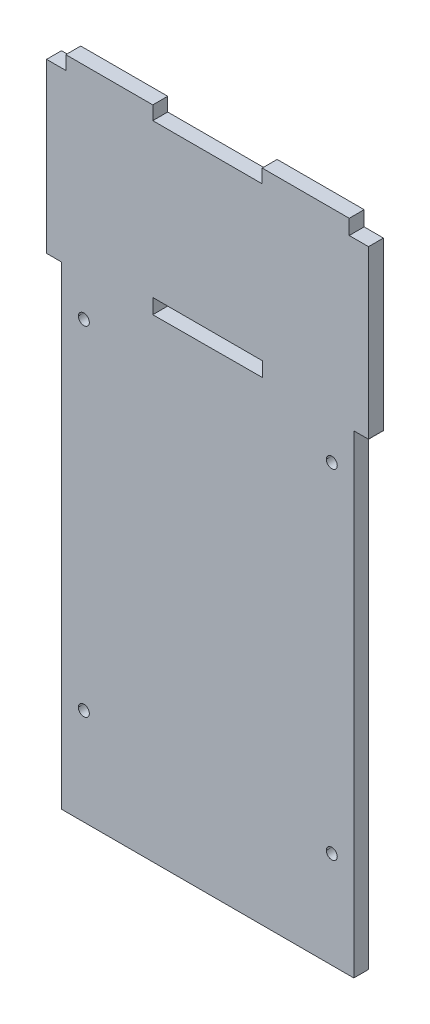
ISO-10303-21;
HEADER;
FILE_DESCRIPTION(('STEP AP214'),'2;1');
FILE_NAME('part.step','',(''),(''),'','','');
FILE_SCHEMA(('AUTOMOTIVE_DESIGN { 1 0 10303 214 1 1 1 1 }'));
ENDSEC;
DATA;
#1=APPLICATION_CONTEXT('core data for automotive mechanical design processes');
#2=APPLICATION_PROTOCOL_DEFINITION('international standard','automotive_design',2000,#1);
#3=PRODUCT_CONTEXT('',#1,'mechanical');
#4=PRODUCT('Part','Part','',(#3));
#5=PRODUCT_RELATED_PRODUCT_CATEGORY('part','',(#4));
#6=PRODUCT_DEFINITION_FORMATION('','',#4);
#7=PRODUCT_DEFINITION_CONTEXT('part definition',#1,'design');
#8=PRODUCT_DEFINITION('design','',#6,#7);
#9=PRODUCT_DEFINITION_SHAPE('','',#8);
#10=(LENGTH_UNIT() NAMED_UNIT(*) SI_UNIT(.MILLI.,.METRE.));
#11=(NAMED_UNIT(*) PLANE_ANGLE_UNIT() SI_UNIT($,.RADIAN.));
#12=(NAMED_UNIT(*) SI_UNIT($,.STERADIAN.) SOLID_ANGLE_UNIT());
#13=UNCERTAINTY_MEASURE_WITH_UNIT(LENGTH_MEASURE(1.E-05),#10,'distance_accuracy_value','');
#14=(GEOMETRIC_REPRESENTATION_CONTEXT(3) GLOBAL_UNCERTAINTY_ASSIGNED_CONTEXT((#13)) GLOBAL_UNIT_ASSIGNED_CONTEXT((#10,
#11,#12)) REPRESENTATION_CONTEXT('',''));
#15=CARTESIAN_POINT('',(0.,0.,0.));
#16=DIRECTION('',(0.,0.,1.));
#17=DIRECTION('',(1.,0.,0.));
#18=AXIS2_PLACEMENT_3D('',#15,#16,#17);
#19=CARTESIAN_POINT('',(0.,0.,4.5));
#20=DIRECTION('',(0.,0.,1.));
#21=DIRECTION('',(1.,0.,0.));
#22=AXIS2_PLACEMENT_3D('',#19,#20,#21);
#23=PLANE('',#22);
#24=DIRECTION('',(1.,0.,0.));
#25=VECTOR('',#24,1.);
#26=CARTESIAN_POINT('',(1244.85837413323,-975.629345589417,4.5));
#27=LINE('',#26,#25);
#28=CARTESIAN_POINT('',(1244.85837413323,-975.629345589417,4.5));
#29=VERTEX_POINT('',#28);
#30=CARTESIAN_POINT('',(1249.29085052101,-975.629345589417,4.5));
#31=VERTEX_POINT('',#30);
#32=EDGE_CURVE('E391',#29,#31,#27,.T.);
#33=ORIENTED_EDGE('',*,*,#32,.T.);
#34=DIRECTION('',(-0.00975087722679571,0.999952459066584,0.));
#35=VECTOR('',#34,1.);
#36=CARTESIAN_POINT('',(1249.29085052101,-975.629345589417,4.5));
#37=LINE('',#36,#35);
#38=CARTESIAN_POINT('',(1249.29014496546,-975.556990867213,4.5));
#39=VERTEX_POINT('',#38);
#40=EDGE_CURVE('E394',#31,#39,#37,.T.);
#41=ORIENTED_EDGE('',*,*,#40,.T.);
#42=DIRECTION('',(0.,1.,0.));
#43=VECTOR('',#42,1.);
#44=CARTESIAN_POINT('',(1249.29014496546,-975.556990867213,4.5));
#45=LINE('',#44,#43);
#46=CARTESIAN_POINT('',(1249.29014496546,-925.376433379758,4.5));
#47=VERTEX_POINT('',#46);
#48=EDGE_CURVE('E397',#39,#47,#45,.T.);
#49=ORIENTED_EDGE('',*,*,#48,.T.);
#50=DIRECTION('',(-1.,0.,0.));
#51=VECTOR('',#50,1.);
#52=CARTESIAN_POINT('',(1249.29014496546,-925.376433379758,4.5));
#53=LINE('',#52,#51);
#54=CARTESIAN_POINT('',(1243.4768963558,-925.376433379758,4.5));
#55=VERTEX_POINT('',#54);
#56=EDGE_CURVE('E399',#47,#55,#53,.T.);
#57=ORIENTED_EDGE('',*,*,#56,.T.);
#58=DIRECTION('',(0.,1.,0.));
#59=VECTOR('',#58,1.);
#60=CARTESIAN_POINT('',(1243.4768963558,-925.376433379758,4.5));
#61=LINE('',#60,#59);
#62=CARTESIAN_POINT('',(1243.4768963558,-920.879186991993,4.5));
#63=VERTEX_POINT('',#62);
#64=EDGE_CURVE('E401',#55,#63,#61,.T.);
#65=ORIENTED_EDGE('',*,*,#64,.T.);
#66=DIRECTION('',(-1.,0.,0.));
#67=VECTOR('',#66,1.);
#68=CARTESIAN_POINT('',(1243.4768963558,-920.879186991993,4.5));
#69=LINE('',#68,#67);
#70=CARTESIAN_POINT('',(1217.26487247346,-920.879186991996,4.5));
#71=VERTEX_POINT('',#70);
#72=EDGE_CURVE('E403',#63,#71,#69,.T.);
#73=ORIENTED_EDGE('',*,*,#72,.T.);
#74=DIRECTION('',(0.,-1.,0.));
#75=VECTOR('',#74,1.);
#76=CARTESIAN_POINT('',(1217.26487247346,-920.879186991996,4.5));
#77=LINE('',#76,#75);
#78=CARTESIAN_POINT('',(1217.26487247346,-924.998820046522,4.5));
#79=VERTEX_POINT('',#78);
#80=EDGE_CURVE('E405',#71,#79,#77,.T.);
#81=ORIENTED_EDGE('',*,*,#80,.T.);
#82=DIRECTION('',(-1.,0.,0.));
#83=VECTOR('',#82,1.);
#84=CARTESIAN_POINT('',(1217.26487247346,-924.998820046522,4.5));
#85=LINE('',#84,#83);
#86=CARTESIAN_POINT('',(1184.2956724817,-924.998820046522,4.5));
#87=VERTEX_POINT('',#86);
#88=EDGE_CURVE('E407',#79,#87,#85,.T.);
#89=ORIENTED_EDGE('',*,*,#88,.T.);
#90=DIRECTION('',(0.,1.,0.));
#91=VECTOR('',#90,1.);
#92=CARTESIAN_POINT('',(1184.2956724817,-924.998820046522,4.5));
#93=LINE('',#92,#91);
#94=CARTESIAN_POINT('',(1184.2956724817,-920.879186991996,4.5));
#95=VERTEX_POINT('',#94);
#96=EDGE_CURVE('E409',#87,#95,#93,.T.);
#97=ORIENTED_EDGE('',*,*,#96,.T.);
#98=DIRECTION('',(-1.,0.,0.));
#99=VECTOR('',#98,1.);
#100=CARTESIAN_POINT('',(1184.2956724817,-920.879186991996,4.5));
#101=LINE('',#100,#99);
#102=CARTESIAN_POINT('',(1158.08364859937,-920.879186991996,4.5));
#103=VERTEX_POINT('',#102);
#104=EDGE_CURVE('E411',#95,#103,#101,.T.);
#105=ORIENTED_EDGE('',*,*,#104,.T.);
#106=DIRECTION('',(0.,-1.,0.));
#107=VECTOR('',#106,1.);
#108=CARTESIAN_POINT('',(1158.08364859937,-920.879186991996,4.5));
#109=LINE('',#108,#107);
#110=CARTESIAN_POINT('',(1158.08364859937,-924.998820046522,4.5));
#111=VERTEX_POINT('',#110);
#112=EDGE_CURVE('E413',#103,#111,#109,.T.);
#113=ORIENTED_EDGE('',*,*,#112,.T.);
#114=DIRECTION('',(-1.,0.,0.));
#115=VECTOR('',#114,1.);
#116=CARTESIAN_POINT('',(1158.08364859937,-924.998820046522,4.5));
#117=LINE('',#116,#115);
#118=CARTESIAN_POINT('',(1152.29071998971,-924.998820046522,4.5));
#119=VERTEX_POINT('',#118);
#120=EDGE_CURVE('E415',#111,#119,#117,.T.);
#121=ORIENTED_EDGE('',*,*,#120,.T.);
#122=DIRECTION('',(0.,-1.,0.));
#123=VECTOR('',#122,1.);
#124=CARTESIAN_POINT('',(1152.29071998971,-924.998820046522,4.5));
#125=LINE('',#124,#123);
#126=CARTESIAN_POINT('',(1152.29071998971,-975.629345589419,4.5));
#127=VERTEX_POINT('',#126);
#128=EDGE_CURVE('E417',#119,#127,#125,.T.);
#129=ORIENTED_EDGE('',*,*,#128,.T.);
#130=DIRECTION('',(1.,0.,0.));
#131=VECTOR('',#130,1.);
#132=CARTESIAN_POINT('',(1152.29071998971,-975.629345589419,4.5));
#133=LINE('',#132,#131);
#134=CARTESIAN_POINT('',(1156.72319637749,-975.629345589419,4.5));
#135=VERTEX_POINT('',#134);
#136=EDGE_CURVE('E419',#127,#135,#133,.T.);
#137=ORIENTED_EDGE('',*,*,#136,.T.);
#138=DIRECTION('',(0.,-1.,0.));
#139=VECTOR('',#138,1.);
#140=CARTESIAN_POINT('',(1156.72319637749,-1118.4058147204,4.5));
#141=LINE('',#140,#139);
#142=CARTESIAN_POINT('',(1156.72319637749,-1118.4058147204,4.5));
#143=VERTEX_POINT('',#142);
#144=EDGE_CURVE('E421',#135,#143,#141,.T.);
#145=ORIENTED_EDGE('',*,*,#144,.T.);
#146=DIRECTION('',(1.,0.,0.));
#147=VECTOR('',#146,1.);
#148=CARTESIAN_POINT('',(1244.85837413323,-1118.4058147204,4.5));
#149=LINE('',#148,#147);
#150=CARTESIAN_POINT('',(1244.85837413323,-1118.4058147204,4.5));
#151=VERTEX_POINT('',#150);
#152=EDGE_CURVE('E423',#143,#151,#149,.T.);
#153=ORIENTED_EDGE('',*,*,#152,.T.);
#154=DIRECTION('',(0.,1.,0.));
#155=VECTOR('',#154,1.);
#156=CARTESIAN_POINT('',(1244.85837413323,-975.629345589417,4.5));
#157=LINE('',#156,#155);
#158=EDGE_CURVE('E425',#151,#29,#157,.T.);
#159=ORIENTED_EDGE('',*,*,#158,.T.);
#160=EDGE_LOOP('',(#33,#41,#49,#57,#65,#73,#81,#89,#97,#105,#113,#121,#129,#137,#145,#153,#159));
#161=FACE_BOUND('',#160,.T.);
#162=CARTESIAN_POINT('',(1236.57292941308,-1089.25582222769,4.5));
#163=CARTESIAN_POINT('',(1236.57292941308,-1090.16704722746,4.5));
#164=CARTESIAN_POINT('',(1237.31224580178,-1090.90569333838,4.5));
#165=CARTESIAN_POINT('',(1238.22311802378,-1090.90569333838,4.5));
#166=CARTESIAN_POINT('',(1239.13469580133,-1090.90569333838,4.5));
#167=CARTESIAN_POINT('',(1239.87334191225,-1090.16704722746,4.5));
#168=CARTESIAN_POINT('',(1239.87334191225,-1089.25582222769,4.5));
#169=B_SPLINE_CURVE_WITH_KNOTS('',3,(#162,#163,#164,#165,#166,#167,#168),.UNSPECIFIED.,.F.,.F.,
(4,3,4),(2.,3.,4.),.UNSPECIFIED.);
#170=CARTESIAN_POINT('',(1236.57292941308,-1089.25582222769,4.5));
#171=VERTEX_POINT('',#170);
#172=CARTESIAN_POINT('',(1239.87334191225,-1089.25582222769,4.5));
#173=VERTEX_POINT('',#172);
#174=EDGE_CURVE('E354',#171,#173,#169,.T.);
#175=ORIENTED_EDGE('',*,*,#174,.F.);
#176=CARTESIAN_POINT('',(1239.87334191225,-1089.25582222769,4.5));
#177=CARTESIAN_POINT('',(1239.87334191225,-1088.34459722791,4.5));
#178=CARTESIAN_POINT('',(1239.13469580133,-1087.60563361699,4.5));
#179=CARTESIAN_POINT('',(1238.22311802378,-1087.60563361699,4.5));
#180=CARTESIAN_POINT('',(1237.31224580178,-1087.60563361699,4.5));
#181=CARTESIAN_POINT('',(1236.57292941308,-1088.34459722791,4.5));
#182=CARTESIAN_POINT('',(1236.57292941308,-1089.25582222769,4.5));
#183=B_SPLINE_CURVE_WITH_KNOTS('',3,(#176,#177,#178,#179,#180,#181,#182),.UNSPECIFIED.,.F.,.F.,
(4,3,4),(0.,1.,2.),.UNSPECIFIED.);
#184=EDGE_CURVE('E360',#173,#171,#183,.T.);
#185=ORIENTED_EDGE('',*,*,#184,.F.);
#186=EDGE_LOOP('',(#175,#185));
#187=FACE_BOUND('',#186,.T.);
#188=CARTESIAN_POINT('',(1161.87290526509,-1089.25582222769,4.5));
#189=CARTESIAN_POINT('',(1161.87290526509,-1090.16704722746,4.5));
#190=CARTESIAN_POINT('',(1162.61225693157,-1090.90569333838,4.5));
#191=CARTESIAN_POINT('',(1163.52312915356,-1090.90569333838,4.5));
#192=CARTESIAN_POINT('',(1164.43470693111,-1090.90569333838,4.5));
#193=CARTESIAN_POINT('',(1165.17331776426,-1090.16704722746,4.5));
#194=CARTESIAN_POINT('',(1165.17331776426,-1089.25582222769,4.5));
#195=B_SPLINE_CURVE_WITH_KNOTS('',3,(#188,#189,#190,#191,#192,#193,#194),.UNSPECIFIED.,.F.,.F.,
(4,3,4),(2.,3.,4.),.UNSPECIFIED.);
#196=CARTESIAN_POINT('',(1161.87290526509,-1089.25582222769,4.5));
#197=VERTEX_POINT('',#196);
#198=CARTESIAN_POINT('',(1165.17331776426,-1089.25582222769,4.5));
#199=VERTEX_POINT('',#198);
#200=EDGE_CURVE('E331',#197,#199,#195,.T.);
#201=ORIENTED_EDGE('',*,*,#200,.F.);
#202=CARTESIAN_POINT('',(1165.17331776426,-1089.25582222769,4.5));
#203=CARTESIAN_POINT('',(1165.17331776426,-1088.34459722791,4.5));
#204=CARTESIAN_POINT('',(1164.43470693111,-1087.60563361699,4.5));
#205=CARTESIAN_POINT('',(1163.52312915356,-1087.60563361699,4.5));
#206=CARTESIAN_POINT('',(1162.61225693157,-1087.60563361699,4.5));
#207=CARTESIAN_POINT('',(1161.87290526509,-1088.34459722791,4.5));
#208=CARTESIAN_POINT('',(1161.87290526509,-1089.25582222769,4.5));
#209=B_SPLINE_CURVE_WITH_KNOTS('',3,(#202,#203,#204,#205,#206,#207,#208),.UNSPECIFIED.,.F.,.F.,
(4,3,4),(0.,1.,2.),.UNSPECIFIED.);
#210=EDGE_CURVE('E325',#199,#197,#209,.T.);
#211=ORIENTED_EDGE('',*,*,#210,.F.);
#212=EDGE_LOOP('',(#201,#211));
#213=FACE_BOUND('',#212,.T.);
#214=CARTESIAN_POINT('',(1236.57292941308,-987.207618086522,4.5));
#215=CARTESIAN_POINT('',(1236.57292941308,-988.119195864072,4.5));
#216=CARTESIAN_POINT('',(1237.31224580178,-988.857806697221,4.5));
#217=CARTESIAN_POINT('',(1238.22311802378,-988.857806697221,4.5));
#218=CARTESIAN_POINT('',(1239.13469580133,-988.857806697221,4.5));
#219=CARTESIAN_POINT('',(1239.87334191225,-988.119195864072,4.5));
#220=CARTESIAN_POINT('',(1239.87334191225,-987.207618086522,4.5));
#221=B_SPLINE_CURVE_WITH_KNOTS('',3,(#214,#215,#216,#217,#218,#219,#220),.UNSPECIFIED.,.F.,.F.,
(4,3,4),(2.,3.,4.),.UNSPECIFIED.);
#222=CARTESIAN_POINT('',(1236.57292941308,-987.207618086522,4.5));
#223=VERTEX_POINT('',#222);
#224=CARTESIAN_POINT('',(1239.87334191225,-987.207618086522,4.5));
#225=VERTEX_POINT('',#224);
#226=EDGE_CURVE('E288',#223,#225,#221,.T.);
#227=ORIENTED_EDGE('',*,*,#226,.F.);
#228=CARTESIAN_POINT('',(1239.87334191225,-987.207618086522,4.5));
#229=CARTESIAN_POINT('',(1239.87334191225,-986.296745864528,4.5));
#230=CARTESIAN_POINT('',(1239.13469580133,-985.557746975824,4.5));
#231=CARTESIAN_POINT('',(1238.22311802378,-985.557746975824,4.5));
#232=CARTESIAN_POINT('',(1237.31224580178,-985.557746975824,4.5));
#233=CARTESIAN_POINT('',(1236.57292941308,-986.296745864528,4.5));
#234=CARTESIAN_POINT('',(1236.57292941308,-987.207618086522,4.5));
#235=B_SPLINE_CURVE_WITH_KNOTS('',3,(#228,#229,#230,#231,#232,#233,#234),.UNSPECIFIED.,.F.,.F.,
(4,3,4),(0.,1.,2.),.UNSPECIFIED.);
#236=EDGE_CURVE('E294',#225,#223,#235,.T.);
#237=ORIENTED_EDGE('',*,*,#236,.F.);
#238=EDGE_LOOP('',(#227,#237));
#239=FACE_BOUND('',#238,.T.);
#240=CARTESIAN_POINT('',(1161.87258776509,-987.207618086525,4.5));
#241=CARTESIAN_POINT('',(1161.87258776509,-988.119195864075,4.5));
#242=CARTESIAN_POINT('',(1162.61190415379,-988.857806697223,4.5));
#243=CARTESIAN_POINT('',(1163.52277637579,-988.857806697223,4.5));
#244=CARTESIAN_POINT('',(1164.43435415334,-988.857806697223,4.5));
#245=CARTESIAN_POINT('',(1165.17296498648,-988.119195864075,4.5));
#246=CARTESIAN_POINT('',(1165.17296498648,-987.207618086525,4.5));
#247=B_SPLINE_CURVE_WITH_KNOTS('',3,(#240,#241,#242,#243,#244,#245,#246),.UNSPECIFIED.,.F.,.F.,
(4,3,4),(2.,3.,4.),.UNSPECIFIED.);
#248=CARTESIAN_POINT('',(1161.87258776509,-987.207618086525,4.5));
#249=VERTEX_POINT('',#248);
#250=CARTESIAN_POINT('',(1165.17296498648,-987.207618086525,4.5));
#251=VERTEX_POINT('',#250);
#252=EDGE_CURVE('E263',#249,#251,#247,.T.);
#253=ORIENTED_EDGE('',*,*,#252,.F.);
#254=CARTESIAN_POINT('',(1165.17296498648,-987.207618086525,4.5));
#255=CARTESIAN_POINT('',(1165.17296498648,-986.296745864531,4.5));
#256=CARTESIAN_POINT('',(1164.43435415334,-985.557746975826,4.5));
#257=CARTESIAN_POINT('',(1163.52277637579,-985.557746975826,4.5));
#258=CARTESIAN_POINT('',(1162.61190415379,-985.557746975826,4.5));
#259=CARTESIAN_POINT('',(1161.87258776509,-986.296745864531,4.5));
#260=CARTESIAN_POINT('',(1161.87258776509,-987.207618086525,4.5));
#261=B_SPLINE_CURVE_WITH_KNOTS('',3,(#254,#255,#256,#257,#258,#259,#260),.UNSPECIFIED.,.F.,.F.,
(4,3,4),(0.,1.,2.),.UNSPECIFIED.);
#262=EDGE_CURVE('E257',#251,#249,#261,.T.);
#263=ORIENTED_EDGE('',*,*,#262,.F.);
#264=EDGE_LOOP('',(#253,#263));
#265=FACE_BOUND('',#264,.T.);
#266=DIRECTION('',(-1.,0.,0.));
#267=VECTOR('',#266,1.);
#268=CARTESIAN_POINT('',(1184.29634275948,-971.129347534989,4.5));
#269=LINE('',#268,#267);
#270=CARTESIAN_POINT('',(1217.28522775123,-971.129347534989,4.5));
#271=VERTEX_POINT('',#270);
#272=CARTESIAN_POINT('',(1184.29634275948,-971.129347534989,4.5));
#273=VERTEX_POINT('',#272);
#274=EDGE_CURVE('E229',#271,#273,#269,.T.);
#275=ORIENTED_EDGE('',*,*,#274,.F.);
#276=DIRECTION('',(0.,1.,0.));
#277=VECTOR('',#276,1.);
#278=CARTESIAN_POINT('',(1217.28522775123,-971.129347534989,4.5));
#279=LINE('',#278,#277);
#280=CARTESIAN_POINT('',(1217.28522775123,-975.502557256117,4.5));
#281=VERTEX_POINT('',#280);
#282=EDGE_CURVE('E221',#281,#271,#279,.T.);
#283=ORIENTED_EDGE('',*,*,#282,.F.);
#284=DIRECTION('',(0.999992614353706,0.00384333683662977,0.));
#285=VECTOR('',#284,1.);
#286=CARTESIAN_POINT('',(1184.29634275948,-975.629345589419,4.5));
#287=LINE('',#286,#285);
#288=CARTESIAN_POINT('',(1184.29634275948,-975.629345589419,4.5));
#289=VERTEX_POINT('',#288);
#290=EDGE_CURVE('E243',#289,#281,#287,.T.);
#291=ORIENTED_EDGE('',*,*,#290,.F.);
#292=DIRECTION('',(0.,-1.,0.));
#293=VECTOR('',#292,1.);
#294=CARTESIAN_POINT('',(1184.29634275948,-971.129347534989,4.5));
#295=LINE('',#294,#293);
#296=EDGE_CURVE('E241',#273,#289,#295,.T.);
#297=ORIENTED_EDGE('',*,*,#296,.F.);
#298=EDGE_LOOP('',(#275,#283,#291,#297));
#299=FACE_BOUND('',#298,.T.);
#300=ADVANCED_FACE('F30',(#161,#187,#213,#239,#265,#299),#23,.T.);
#301=CARTESIAN_POINT('',(0.,0.,0.));
#302=DIRECTION('',(0.,0.,1.));
#303=DIRECTION('',(1.,0.,0.));
#304=AXIS2_PLACEMENT_3D('',#301,#302,#303);
#305=PLANE('',#304);
#306=CARTESIAN_POINT('',(1165.17296498648,-987.207618086525,0.));
#307=CARTESIAN_POINT('',(1165.17296498648,-986.296745864531,0.));
#308=CARTESIAN_POINT('',(1164.43435415334,-985.557746975826,0.));
#309=CARTESIAN_POINT('',(1163.52277637579,-985.557746975826,0.));
#310=CARTESIAN_POINT('',(1162.61190415379,-985.557746975826,0.));
#311=CARTESIAN_POINT('',(1161.87258776509,-986.296745864531,0.));
#312=CARTESIAN_POINT('',(1161.87258776509,-987.207618086525,0.));
#313=B_SPLINE_CURVE_WITH_KNOTS('',3,(#306,#307,#308,#309,#310,#311,#312),.UNSPECIFIED.,.F.,.F.,
(4,3,4),(0.,1.,2.),.UNSPECIFIED.);
#314=CARTESIAN_POINT('',(1165.17296498648,-987.207618086525,0.));
#315=VERTEX_POINT('',#314);
#316=CARTESIAN_POINT('',(1161.87258776509,-987.207618086525,0.));
#317=VERTEX_POINT('',#316);
#318=EDGE_CURVE('E237',#315,#317,#313,.T.);
#319=ORIENTED_EDGE('',*,*,#318,.T.);
#320=CARTESIAN_POINT('',(1161.87258776509,-987.207618086525,0.));
#321=CARTESIAN_POINT('',(1161.87258776509,-988.119195864075,0.));
#322=CARTESIAN_POINT('',(1162.61190415379,-988.857806697223,0.));
#323=CARTESIAN_POINT('',(1163.52277637579,-988.857806697223,0.));
#324=CARTESIAN_POINT('',(1164.43435415334,-988.857806697223,0.));
#325=CARTESIAN_POINT('',(1165.17296498648,-988.119195864075,0.));
#326=CARTESIAN_POINT('',(1165.17296498648,-987.207618086525,0.));
#327=B_SPLINE_CURVE_WITH_KNOTS('',3,(#320,#321,#322,#323,#324,#325,#326),.UNSPECIFIED.,.F.,.F.,
(4,3,4),(2.,3.,4.),.UNSPECIFIED.);
#328=EDGE_CURVE('E264',#317,#315,#327,.T.);
#329=ORIENTED_EDGE('',*,*,#328,.T.);
#330=EDGE_LOOP('',(#319,#329));
#331=FACE_BOUND('',#330,.T.);
#332=CARTESIAN_POINT('',(1165.17331776426,-1089.25582222769,0.));
#333=CARTESIAN_POINT('',(1165.17331776426,-1088.34459722791,0.));
#334=CARTESIAN_POINT('',(1164.43470693111,-1087.60563361699,0.));
#335=CARTESIAN_POINT('',(1163.52312915356,-1087.60563361699,0.));
#336=CARTESIAN_POINT('',(1162.61225693157,-1087.60563361699,0.));
#337=CARTESIAN_POINT('',(1161.87290526509,-1088.34459722791,0.));
#338=CARTESIAN_POINT('',(1161.87290526509,-1089.25582222769,0.));
#339=B_SPLINE_CURVE_WITH_KNOTS('',3,(#332,#333,#334,#335,#336,#337,#338),.UNSPECIFIED.,.F.,.F.,
(4,3,4),(0.,1.,2.),.UNSPECIFIED.);
#340=CARTESIAN_POINT('',(1165.17331776426,-1089.25582222769,0.));
#341=VERTEX_POINT('',#340);
#342=CARTESIAN_POINT('',(1161.87290526509,-1089.25582222769,0.));
#343=VERTEX_POINT('',#342);
#344=EDGE_CURVE('E324',#341,#343,#339,.T.);
#345=ORIENTED_EDGE('',*,*,#344,.T.);
#346=CARTESIAN_POINT('',(1161.87290526509,-1089.25582222769,0.));
#347=CARTESIAN_POINT('',(1161.87290526509,-1090.16704722746,0.));
#348=CARTESIAN_POINT('',(1162.61225693157,-1090.90569333838,0.));
#349=CARTESIAN_POINT('',(1163.52312915356,-1090.90569333838,0.));
#350=CARTESIAN_POINT('',(1164.43470693111,-1090.90569333838,0.));
#351=CARTESIAN_POINT('',(1165.17331776426,-1090.16704722746,0.));
#352=CARTESIAN_POINT('',(1165.17331776426,-1089.25582222769,0.));
#353=B_SPLINE_CURVE_WITH_KNOTS('',3,(#346,#347,#348,#349,#350,#351,#352),.UNSPECIFIED.,.F.,.F.,
(4,3,4),(2.,3.,4.),.UNSPECIFIED.);
#354=EDGE_CURVE('E332',#343,#341,#353,.T.);
#355=ORIENTED_EDGE('',*,*,#354,.T.);
#356=EDGE_LOOP('',(#345,#355));
#357=FACE_BOUND('',#356,.T.);
#358=DIRECTION('',(1.,0.,0.));
#359=VECTOR('',#358,1.);
#360=CARTESIAN_POINT('',(1244.85837413323,-975.629345589417,0.));
#361=LINE('',#360,#359);
#362=CARTESIAN_POINT('',(1244.85837413323,-975.629345589417,0.));
#363=VERTEX_POINT('',#362);
#364=CARTESIAN_POINT('',(1249.29085052101,-975.629345589417,0.));
#365=VERTEX_POINT('',#364);
#366=EDGE_CURVE('E390',#363,#365,#361,.T.);
#367=ORIENTED_EDGE('',*,*,#366,.F.);
#368=DIRECTION('',(0.,1.,0.));
#369=VECTOR('',#368,1.);
#370=CARTESIAN_POINT('',(1244.85837413323,-975.629345589417,0.));
#371=LINE('',#370,#369);
#372=CARTESIAN_POINT('',(1244.85837413323,-1118.4058147204,0.));
#373=VERTEX_POINT('',#372);
#374=EDGE_CURVE('E395',#373,#363,#371,.T.);
#375=ORIENTED_EDGE('',*,*,#374,.F.);
#376=DIRECTION('',(1.,0.,0.));
#377=VECTOR('',#376,1.);
#378=CARTESIAN_POINT('',(1244.85837413323,-1118.4058147204,0.));
#379=LINE('',#378,#377);
#380=CARTESIAN_POINT('',(1156.72319637749,-1118.4058147204,0.));
#381=VERTEX_POINT('',#380);
#382=EDGE_CURVE('E460',#381,#373,#379,.T.);
#383=ORIENTED_EDGE('',*,*,#382,.F.);
#384=DIRECTION('',(0.,-1.,0.));
#385=VECTOR('',#384,1.);
#386=CARTESIAN_POINT('',(1156.72319637749,-1118.4058147204,0.));
#387=LINE('',#386,#385);
#388=CARTESIAN_POINT('',(1156.72319637749,-975.629345589419,0.));
#389=VERTEX_POINT('',#388);
#390=EDGE_CURVE('E458',#389,#381,#387,.T.);
#391=ORIENTED_EDGE('',*,*,#390,.F.);
#392=DIRECTION('',(1.,0.,0.));
#393=VECTOR('',#392,1.);
#394=CARTESIAN_POINT('',(1152.29071998971,-975.629345589419,0.));
#395=LINE('',#394,#393);
#396=CARTESIAN_POINT('',(1152.29071998971,-975.629345589419,0.));
#397=VERTEX_POINT('',#396);
#398=EDGE_CURVE('E456',#397,#389,#395,.T.);
#399=ORIENTED_EDGE('',*,*,#398,.F.);
#400=DIRECTION('',(0.,-1.,0.));
#401=VECTOR('',#400,1.);
#402=CARTESIAN_POINT('',(1152.29071998971,-975.556990867216,0.));
#403=LINE('',#402,#401);
#404=CARTESIAN_POINT('',(1152.29071998971,-924.998820046522,0.));
#405=VERTEX_POINT('',#404);
#406=EDGE_CURVE('E454',#405,#397,#403,.T.);
#407=ORIENTED_EDGE('',*,*,#406,.F.);
#408=DIRECTION('',(-1.,0.,0.));
#409=VECTOR('',#408,1.);
#410=CARTESIAN_POINT('',(1158.08364859937,-924.998820046522,0.));
#411=LINE('',#410,#409);
#412=CARTESIAN_POINT('',(1158.08364859937,-924.998820046522,0.));
#413=VERTEX_POINT('',#412);
#414=EDGE_CURVE('E451',#413,#405,#411,.T.);
#415=ORIENTED_EDGE('',*,*,#414,.F.);
#416=DIRECTION('',(0.,-1.,0.));
#417=VECTOR('',#416,1.);
#418=CARTESIAN_POINT('',(1158.08364859937,-920.879186991996,0.));
#419=LINE('',#418,#417);
#420=CARTESIAN_POINT('',(1158.08364859937,-920.879186991996,0.));
#421=VERTEX_POINT('',#420);
#422=EDGE_CURVE('E449',#421,#413,#419,.T.);
#423=ORIENTED_EDGE('',*,*,#422,.F.);
#424=DIRECTION('',(-1.,0.,0.));
#425=VECTOR('',#424,1.);
#426=CARTESIAN_POINT('',(1184.2956724817,-920.879186991996,0.));
#427=LINE('',#426,#425);
#428=CARTESIAN_POINT('',(1184.2956724817,-920.879186991996,0.));
#429=VERTEX_POINT('',#428);
#430=EDGE_CURVE('E447',#429,#421,#427,.T.);
#431=ORIENTED_EDGE('',*,*,#430,.F.);
#432=DIRECTION('',(0.,1.,0.));
#433=VECTOR('',#432,1.);
#434=CARTESIAN_POINT('',(1184.2956724817,-924.998820046522,0.));
#435=LINE('',#434,#433);
#436=CARTESIAN_POINT('',(1184.2956724817,-924.998820046522,0.));
#437=VERTEX_POINT('',#436);
#438=EDGE_CURVE('E445',#437,#429,#435,.T.);
#439=ORIENTED_EDGE('',*,*,#438,.F.);
#440=DIRECTION('',(-1.,0.,0.));
#441=VECTOR('',#440,1.);
#442=CARTESIAN_POINT('',(1217.26487247346,-924.998820046522,0.));
#443=LINE('',#442,#441);
#444=CARTESIAN_POINT('',(1217.26487247346,-924.998820046522,0.));
#445=VERTEX_POINT('',#444);
#446=EDGE_CURVE('E443',#445,#437,#443,.T.);
#447=ORIENTED_EDGE('',*,*,#446,.F.);
#448=DIRECTION('',(0.,-1.,0.));
#449=VECTOR('',#448,1.);
#450=CARTESIAN_POINT('',(1217.26487247346,-920.879186991996,0.));
#451=LINE('',#450,#449);
#452=CARTESIAN_POINT('',(1217.26487247346,-920.879186991996,0.));
#453=VERTEX_POINT('',#452);
#454=EDGE_CURVE('E441',#453,#445,#451,.T.);
#455=ORIENTED_EDGE('',*,*,#454,.F.);
#456=DIRECTION('',(-1.,0.,0.));
#457=VECTOR('',#456,1.);
#458=CARTESIAN_POINT('',(1243.4768963558,-920.879186991993,0.));
#459=LINE('',#458,#457);
#460=CARTESIAN_POINT('',(1243.4768963558,-920.879186991993,0.));
#461=VERTEX_POINT('',#460);
#462=EDGE_CURVE('E439',#461,#453,#459,.T.);
#463=ORIENTED_EDGE('',*,*,#462,.F.);
#464=DIRECTION('',(0.,1.,0.));
#465=VECTOR('',#464,1.);
#466=CARTESIAN_POINT('',(1243.4768963558,-925.376433379758,0.));
#467=LINE('',#466,#465);
#468=CARTESIAN_POINT('',(1243.4768963558,-925.376433379758,0.));
#469=VERTEX_POINT('',#468);
#470=EDGE_CURVE('E437',#469,#461,#467,.T.);
#471=ORIENTED_EDGE('',*,*,#470,.F.);
#472=DIRECTION('',(-1.,0.,0.));
#473=VECTOR('',#472,1.);
#474=CARTESIAN_POINT('',(1249.29014496546,-925.376433379758,0.));
#475=LINE('',#474,#473);
#476=CARTESIAN_POINT('',(1249.29014496546,-925.376433379758,0.));
#477=VERTEX_POINT('',#476);
#478=EDGE_CURVE('E435',#477,#469,#475,.T.);
#479=ORIENTED_EDGE('',*,*,#478,.F.);
#480=DIRECTION('',(0.,1.,0.));
#481=VECTOR('',#480,1.);
#482=CARTESIAN_POINT('',(1249.29014496546,-952.082099206415,0.));
#483=LINE('',#482,#481);
#484=CARTESIAN_POINT('',(1249.29014496546,-975.556990867213,0.));
#485=VERTEX_POINT('',#484);
#486=EDGE_CURVE('E433',#485,#477,#483,.T.);
#487=ORIENTED_EDGE('',*,*,#486,.F.);
#488=DIRECTION('',(-0.00975087722679571,0.999952459066584,0.));
#489=VECTOR('',#488,1.);
#490=CARTESIAN_POINT('',(1249.29085052101,-975.629345589417,0.));
#491=LINE('',#490,#489);
#492=EDGE_CURVE('E430',#365,#485,#491,.T.);
#493=ORIENTED_EDGE('',*,*,#492,.F.);
#494=EDGE_LOOP('',(#367,#375,#383,#391,#399,#407,#415,#423,#431,#439,#447,#455,#463,#471,#479,
#487,#493));
#495=FACE_BOUND('',#494,.T.);
#496=CARTESIAN_POINT('',(1239.87334191225,-1089.25582222769,0.));
#497=CARTESIAN_POINT('',(1239.87334191225,-1088.34459722791,0.));
#498=CARTESIAN_POINT('',(1239.13469580133,-1087.60563361699,0.));
#499=CARTESIAN_POINT('',(1238.22311802378,-1087.60563361699,0.));
#500=CARTESIAN_POINT('',(1237.31224580178,-1087.60563361699,0.));
#501=CARTESIAN_POINT('',(1236.57292941308,-1088.34459722791,0.));
#502=CARTESIAN_POINT('',(1236.57292941308,-1089.25582222769,0.));
#503=B_SPLINE_CURVE_WITH_KNOTS('',3,(#496,#497,#498,#499,#500,#501,#502),.UNSPECIFIED.,.F.,.F.,
(4,3,4),(0.,1.,2.),.UNSPECIFIED.);
#504=CARTESIAN_POINT('',(1239.87334191225,-1089.25582222769,0.));
#505=VERTEX_POINT('',#504);
#506=CARTESIAN_POINT('',(1236.57292941308,-1089.25582222769,0.));
#507=VERTEX_POINT('',#506);
#508=EDGE_CURVE('E365',#505,#507,#503,.T.);
#509=ORIENTED_EDGE('',*,*,#508,.T.);
#510=CARTESIAN_POINT('',(1236.57292941308,-1089.25582222769,0.));
#511=CARTESIAN_POINT('',(1236.57292941308,-1090.16704722746,0.));
#512=CARTESIAN_POINT('',(1237.31224580178,-1090.90569333838,0.));
#513=CARTESIAN_POINT('',(1238.22311802378,-1090.90569333838,0.));
#514=CARTESIAN_POINT('',(1239.13469580133,-1090.90569333838,0.));
#515=CARTESIAN_POINT('',(1239.87334191225,-1090.16704722746,0.));
#516=CARTESIAN_POINT('',(1239.87334191225,-1089.25582222769,0.));
#517=B_SPLINE_CURVE_WITH_KNOTS('',3,(#510,#511,#512,#513,#514,#515,#516),.UNSPECIFIED.,.F.,.F.,
(4,3,4),(2.,3.,4.),.UNSPECIFIED.);
#518=EDGE_CURVE('E373',#507,#505,#517,.T.);
#519=ORIENTED_EDGE('',*,*,#518,.T.);
#520=EDGE_LOOP('',(#509,#519));
#521=FACE_BOUND('',#520,.T.);
#522=CARTESIAN_POINT('',(1239.87334191225,-987.207618086522,0.));
#523=CARTESIAN_POINT('',(1239.87334191225,-986.296745864528,0.));
#524=CARTESIAN_POINT('',(1239.13469580133,-985.557746975824,0.));
#525=CARTESIAN_POINT('',(1238.22311802378,-985.557746975824,0.));
#526=CARTESIAN_POINT('',(1237.31224580178,-985.557746975824,0.));
#527=CARTESIAN_POINT('',(1236.57292941308,-986.296745864528,0.));
#528=CARTESIAN_POINT('',(1236.57292941308,-987.207618086522,0.));
#529=B_SPLINE_CURVE_WITH_KNOTS('',3,(#522,#523,#524,#525,#526,#527,#528),.UNSPECIFIED.,.F.,.F.,
(4,3,4),(0.,1.,2.),.UNSPECIFIED.);
#530=CARTESIAN_POINT('',(1239.87334191225,-987.207618086522,0.));
#531=VERTEX_POINT('',#530);
#532=CARTESIAN_POINT('',(1236.57292941308,-987.207618086522,0.));
#533=VERTEX_POINT('',#532);
#534=EDGE_CURVE('E299',#531,#533,#529,.T.);
#535=ORIENTED_EDGE('',*,*,#534,.T.);
#536=CARTESIAN_POINT('',(1236.57292941308,-987.207618086522,0.));
#537=CARTESIAN_POINT('',(1236.57292941308,-988.119195864072,0.));
#538=CARTESIAN_POINT('',(1237.31224580178,-988.857806697221,0.));
#539=CARTESIAN_POINT('',(1238.22311802378,-988.857806697221,0.));
#540=CARTESIAN_POINT('',(1239.13469580133,-988.857806697221,0.));
#541=CARTESIAN_POINT('',(1239.87334191225,-988.119195864072,0.));
#542=CARTESIAN_POINT('',(1239.87334191225,-987.207618086522,0.));
#543=B_SPLINE_CURVE_WITH_KNOTS('',3,(#536,#537,#538,#539,#540,#541,#542),.UNSPECIFIED.,.F.,.F.,
(4,3,4),(2.,3.,4.),.UNSPECIFIED.);
#544=EDGE_CURVE('E307',#533,#531,#543,.T.);
#545=ORIENTED_EDGE('',*,*,#544,.T.);
#546=EDGE_LOOP('',(#535,#545));
#547=FACE_BOUND('',#546,.T.);
#548=DIRECTION('',(0.,1.,0.));
#549=VECTOR('',#548,1.);
#550=CARTESIAN_POINT('',(1217.28522775123,-971.129347534989,0.));
#551=LINE('',#550,#549);
#552=CARTESIAN_POINT('',(1217.28522775123,-975.502557256117,0.));
#553=VERTEX_POINT('',#552);
#554=CARTESIAN_POINT('',(1217.28522775123,-971.129347534989,0.));
#555=VERTEX_POINT('',#554);
#556=EDGE_CURVE('E53',#553,#555,#551,.T.);
#557=ORIENTED_EDGE('',*,*,#556,.T.);
#558=DIRECTION('',(-1.,0.,0.));
#559=VECTOR('',#558,1.);
#560=CARTESIAN_POINT('',(1184.29634275948,-971.129347534989,0.));
#561=LINE('',#560,#559);
#562=CARTESIAN_POINT('',(1184.29634275948,-971.129347534989,0.));
#563=VERTEX_POINT('',#562);
#564=EDGE_CURVE('E236',#555,#563,#561,.T.);
#565=ORIENTED_EDGE('',*,*,#564,.T.);
#566=DIRECTION('',(0.,-1.,0.));
#567=VECTOR('',#566,1.);
#568=CARTESIAN_POINT('',(1184.29634275948,-971.129347534989,0.));
#569=LINE('',#568,#567);
#570=CARTESIAN_POINT('',(1184.29634275948,-975.629345589419,0.));
#571=VERTEX_POINT('',#570);
#572=EDGE_CURVE('E249',#563,#571,#569,.T.);
#573=ORIENTED_EDGE('',*,*,#572,.T.);
#574=DIRECTION('',(0.999992614353706,0.00384333683662977,0.));
#575=VECTOR('',#574,1.);
#576=CARTESIAN_POINT('',(1184.29634275948,-975.629345589419,0.));
#577=LINE('',#576,#575);
#578=EDGE_CURVE('E230',#571,#553,#577,.T.);
#579=ORIENTED_EDGE('',*,*,#578,.T.);
#580=EDGE_LOOP('',(#557,#565,#573,#579));
#581=FACE_BOUND('',#580,.T.);
#582=ADVANCED_FACE('F517',(#331,#357,#495,#521,#547,#581),#305,.F.);
#583=CARTESIAN_POINT('',(1244.85837413323,-975.629345589417,4.5));
#584=DIRECTION('',(0.,1.,0.));
#585=DIRECTION('',(0.,0.,1.));
#586=AXIS2_PLACEMENT_3D('',#583,#584,#585);
#587=PLANE('',#586);
#588=ORIENTED_EDGE('',*,*,#366,.T.);
#589=DIRECTION('',(0.,0.,-1.));
#590=VECTOR('',#589,1.);
#591=CARTESIAN_POINT('',(1249.29085052101,-975.629345589417,4.5));
#592=LINE('',#591,#590);
#593=EDGE_CURVE('E11',#31,#365,#592,.T.);
#594=ORIENTED_EDGE('',*,*,#593,.F.);
#595=ORIENTED_EDGE('',*,*,#32,.F.);
#596=DIRECTION('',(0.,0.,-1.));
#597=VECTOR('',#596,1.);
#598=CARTESIAN_POINT('',(1244.85837413323,-975.629345589417,4.5));
#599=LINE('',#598,#597);
#600=EDGE_CURVE('E427',#29,#363,#599,.T.);
#601=ORIENTED_EDGE('',*,*,#600,.T.);
#602=EDGE_LOOP('',(#588,#594,#595,#601));
#603=FACE_BOUND('',#602,.T.);
#604=ADVANCED_FACE('F32',(#603),#587,.F.);
#605=CARTESIAN_POINT('',(1249.29085052101,-975.629345589417,4.5));
#606=DIRECTION('',(-0.999952459066584,-0.00975087722679571,0.));
#607=DIRECTION('',(0.00975087722679571,-0.999952459066584,0.));
#608=AXIS2_PLACEMENT_3D('',#605,#606,#607);
#609=PLANE('',#608);
#610=ORIENTED_EDGE('',*,*,#492,.T.);
#611=DIRECTION('',(0.,0.,-1.));
#612=VECTOR('',#611,1.);
#613=CARTESIAN_POINT('',(1249.29014496546,-975.556990867213,4.5));
#614=LINE('',#613,#612);
#615=EDGE_CURVE('E38',#39,#485,#614,.T.);
#616=ORIENTED_EDGE('',*,*,#615,.F.);
#617=ORIENTED_EDGE('',*,*,#40,.F.);
#618=ORIENTED_EDGE('',*,*,#593,.T.);
#619=EDGE_LOOP('',(#610,#616,#617,#618));
#620=FACE_BOUND('',#619,.T.);
#621=ADVANCED_FACE('F513',(#620),#609,.F.);
#622=CARTESIAN_POINT('',(1249.29014496546,-952.082099206415,4.5));
#623=DIRECTION('',(-1.,0.,0.));
#624=DIRECTION('',(0.,0.,1.));
#625=AXIS2_PLACEMENT_3D('',#622,#623,#624);
#626=PLANE('',#625);
#627=ORIENTED_EDGE('',*,*,#486,.T.);
#628=DIRECTION('',(0.,0.,-1.));
#629=VECTOR('',#628,1.);
#630=CARTESIAN_POINT('',(1249.29014496546,-925.376433379758,4.5));
#631=LINE('',#630,#629);
#632=EDGE_CURVE('E504',#47,#477,#631,.T.);
#633=ORIENTED_EDGE('',*,*,#632,.F.);
#634=ORIENTED_EDGE('',*,*,#48,.F.);
#635=ORIENTED_EDGE('',*,*,#615,.T.);
#636=EDGE_LOOP('',(#627,#633,#634,#635));
#637=FACE_BOUND('',#636,.T.);
#638=ADVANCED_FACE('F510',(#637),#626,.F.);
#639=CARTESIAN_POINT('',(1249.29014496546,-925.376433379758,4.5));
#640=DIRECTION('',(0.,-1.,0.));
#641=DIRECTION('',(0.,0.,-1.));
#642=AXIS2_PLACEMENT_3D('',#639,#640,#641);
#643=PLANE('',#642);
#644=ORIENTED_EDGE('',*,*,#478,.T.);
#645=DIRECTION('',(0.,0.,-1.));
#646=VECTOR('',#645,1.);
#647=CARTESIAN_POINT('',(1243.4768963558,-925.376433379758,4.5));
#648=LINE('',#647,#646);
#649=EDGE_CURVE('E501',#55,#469,#648,.T.);
#650=ORIENTED_EDGE('',*,*,#649,.F.);
#651=ORIENTED_EDGE('',*,*,#56,.F.);
#652=ORIENTED_EDGE('',*,*,#632,.T.);
#653=EDGE_LOOP('',(#644,#650,#651,#652));
#654=FACE_BOUND('',#653,.T.);
#655=ADVANCED_FACE('F525',(#654),#643,.F.);
#656=CARTESIAN_POINT('',(1243.4768963558,-925.376433379758,4.5));
#657=DIRECTION('',(-1.,0.,0.));
#658=DIRECTION('',(0.,0.,1.));
#659=AXIS2_PLACEMENT_3D('',#656,#657,#658);
#660=PLANE('',#659);
#661=ORIENTED_EDGE('',*,*,#470,.T.);
#662=DIRECTION('',(0.,0.,-1.));
#663=VECTOR('',#662,1.);
#664=CARTESIAN_POINT('',(1243.4768963558,-920.879186991993,4.5));
#665=LINE('',#664,#663);
#666=EDGE_CURVE('E498',#63,#461,#665,.T.);
#667=ORIENTED_EDGE('',*,*,#666,.F.);
#668=ORIENTED_EDGE('',*,*,#64,.F.);
#669=ORIENTED_EDGE('',*,*,#649,.T.);
#670=EDGE_LOOP('',(#661,#667,#668,#669));
#671=FACE_BOUND('',#670,.T.);
#672=ADVANCED_FACE('F529',(#671),#660,.F.);
#673=CARTESIAN_POINT('',(1243.4768963558,-920.879186991993,4.5));
#674=DIRECTION('',(0.,-1.,0.));
#675=DIRECTION('',(0.,0.,-1.));
#676=AXIS2_PLACEMENT_3D('',#673,#674,#675);
#677=PLANE('',#676);
#678=ORIENTED_EDGE('',*,*,#462,.T.);
#679=DIRECTION('',(0.,0.,-1.));
#680=VECTOR('',#679,1.);
#681=CARTESIAN_POINT('',(1217.26487247346,-920.879186991996,4.5));
#682=LINE('',#681,#680);
#683=EDGE_CURVE('E495',#71,#453,#682,.T.);
#684=ORIENTED_EDGE('',*,*,#683,.F.);
#685=ORIENTED_EDGE('',*,*,#72,.F.);
#686=ORIENTED_EDGE('',*,*,#666,.T.);
#687=EDGE_LOOP('',(#678,#684,#685,#686));
#688=FACE_BOUND('',#687,.T.);
#689=ADVANCED_FACE('F591',(#688),#677,.F.);
#690=CARTESIAN_POINT('',(1217.26487247346,-920.879186991996,4.5));
#691=DIRECTION('',(1.,0.,0.));
#692=DIRECTION('',(0.,0.,-1.));
#693=AXIS2_PLACEMENT_3D('',#690,#691,#692);
#694=PLANE('',#693);
#695=ORIENTED_EDGE('',*,*,#454,.T.);
#696=DIRECTION('',(0.,0.,-1.));
#697=VECTOR('',#696,1.);
#698=CARTESIAN_POINT('',(1217.26487247346,-924.998820046522,4.5));
#699=LINE('',#698,#697);
#700=EDGE_CURVE('E492',#79,#445,#699,.T.);
#701=ORIENTED_EDGE('',*,*,#700,.F.);
#702=ORIENTED_EDGE('',*,*,#80,.F.);
#703=ORIENTED_EDGE('',*,*,#683,.T.);
#704=EDGE_LOOP('',(#695,#701,#702,#703));
#705=FACE_BOUND('',#704,.T.);
#706=ADVANCED_FACE('F588',(#705),#694,.F.);
#707=CARTESIAN_POINT('',(1217.26487247346,-924.998820046522,4.5));
#708=DIRECTION('',(0.,-1.,0.));
#709=DIRECTION('',(0.,0.,-1.));
#710=AXIS2_PLACEMENT_3D('',#707,#708,#709);
#711=PLANE('',#710);
#712=ORIENTED_EDGE('',*,*,#446,.T.);
#713=DIRECTION('',(0.,0.,-1.));
#714=VECTOR('',#713,1.);
#715=CARTESIAN_POINT('',(1184.2956724817,-924.998820046522,4.5));
#716=LINE('',#715,#714);
#717=EDGE_CURVE('E489',#87,#437,#716,.T.);
#718=ORIENTED_EDGE('',*,*,#717,.F.);
#719=ORIENTED_EDGE('',*,*,#88,.F.);
#720=ORIENTED_EDGE('',*,*,#700,.T.);
#721=EDGE_LOOP('',(#712,#718,#719,#720));
#722=FACE_BOUND('',#721,.T.);
#723=ADVANCED_FACE('F584',(#722),#711,.F.);
#724=CARTESIAN_POINT('',(1184.2956724817,-924.998820046522,4.5));
#725=DIRECTION('',(-1.,0.,0.));
#726=DIRECTION('',(0.,0.,1.));
#727=AXIS2_PLACEMENT_3D('',#724,#725,#726);
#728=PLANE('',#727);
#729=ORIENTED_EDGE('',*,*,#438,.T.);
#730=DIRECTION('',(0.,0.,-1.));
#731=VECTOR('',#730,1.);
#732=CARTESIAN_POINT('',(1184.2956724817,-920.879186991996,4.5));
#733=LINE('',#732,#731);
#734=EDGE_CURVE('E486',#95,#429,#733,.T.);
#735=ORIENTED_EDGE('',*,*,#734,.F.);
#736=ORIENTED_EDGE('',*,*,#96,.F.);
#737=ORIENTED_EDGE('',*,*,#717,.T.);
#738=EDGE_LOOP('',(#729,#735,#736,#737));
#739=FACE_BOUND('',#738,.T.);
#740=ADVANCED_FACE('F580',(#739),#728,.F.);
#741=CARTESIAN_POINT('',(1184.2956724817,-920.879186991996,4.5));
#742=DIRECTION('',(0.,-1.,0.));
#743=DIRECTION('',(0.,0.,-1.));
#744=AXIS2_PLACEMENT_3D('',#741,#742,#743);
#745=PLANE('',#744);
#746=ORIENTED_EDGE('',*,*,#430,.T.);
#747=DIRECTION('',(0.,0.,-1.));
#748=VECTOR('',#747,1.);
#749=CARTESIAN_POINT('',(1158.08364859937,-920.879186991996,4.5));
#750=LINE('',#749,#748);
#751=EDGE_CURVE('E483',#103,#421,#750,.T.);
#752=ORIENTED_EDGE('',*,*,#751,.F.);
#753=ORIENTED_EDGE('',*,*,#104,.F.);
#754=ORIENTED_EDGE('',*,*,#734,.T.);
#755=EDGE_LOOP('',(#746,#752,#753,#754));
#756=FACE_BOUND('',#755,.T.);
#757=ADVANCED_FACE('F576',(#756),#745,.F.);
#758=CARTESIAN_POINT('',(1158.08364859937,-920.879186991996,4.5));
#759=DIRECTION('',(1.,0.,0.));
#760=DIRECTION('',(0.,0.,-1.));
#761=AXIS2_PLACEMENT_3D('',#758,#759,#760);
#762=PLANE('',#761);
#763=ORIENTED_EDGE('',*,*,#422,.T.);
#764=DIRECTION('',(0.,0.,-1.));
#765=VECTOR('',#764,1.);
#766=CARTESIAN_POINT('',(1158.08364859937,-924.998820046522,4.5));
#767=LINE('',#766,#765);
#768=EDGE_CURVE('E480',#111,#413,#767,.T.);
#769=ORIENTED_EDGE('',*,*,#768,.F.);
#770=ORIENTED_EDGE('',*,*,#112,.F.);
#771=ORIENTED_EDGE('',*,*,#751,.T.);
#772=EDGE_LOOP('',(#763,#769,#770,#771));
#773=FACE_BOUND('',#772,.T.);
#774=ADVANCED_FACE('F571',(#773),#762,.F.);
#775=CARTESIAN_POINT('',(1158.08364859937,-924.998820046522,4.5));
#776=DIRECTION('',(0.,-1.,0.));
#777=DIRECTION('',(0.,0.,-1.));
#778=AXIS2_PLACEMENT_3D('',#775,#776,#777);
#779=PLANE('',#778);
#780=ORIENTED_EDGE('',*,*,#414,.T.);
#781=DIRECTION('',(0.,0.,-1.));
#782=VECTOR('',#781,1.);
#783=CARTESIAN_POINT('',(1152.29071998971,-924.998820046522,4.5));
#784=LINE('',#783,#782);
#785=EDGE_CURVE('E477',#119,#405,#784,.T.);
#786=ORIENTED_EDGE('',*,*,#785,.F.);
#787=ORIENTED_EDGE('',*,*,#120,.F.);
#788=ORIENTED_EDGE('',*,*,#768,.T.);
#789=EDGE_LOOP('',(#780,#786,#787,#788));
#790=FACE_BOUND('',#789,.T.);
#791=ADVANCED_FACE('F562',(#790),#779,.F.);
#792=CARTESIAN_POINT('',(1152.29071998971,-975.556990867216,4.5));
#793=DIRECTION('',(1.,0.,0.));
#794=DIRECTION('',(0.,0.,-1.));
#795=AXIS2_PLACEMENT_3D('',#792,#793,#794);
#796=PLANE('',#795);
#797=ORIENTED_EDGE('',*,*,#406,.T.);
#798=DIRECTION('',(0.,0.,-1.));
#799=VECTOR('',#798,1.);
#800=CARTESIAN_POINT('',(1152.29071998971,-975.629345589419,4.5));
#801=LINE('',#800,#799);
#802=EDGE_CURVE('E474',#127,#397,#801,.T.);
#803=ORIENTED_EDGE('',*,*,#802,.F.);
#804=ORIENTED_EDGE('',*,*,#128,.F.);
#805=ORIENTED_EDGE('',*,*,#785,.T.);
#806=EDGE_LOOP('',(#797,#803,#804,#805));
#807=FACE_BOUND('',#806,.T.);
#808=ADVANCED_FACE('F566',(#807),#796,.F.);
#809=CARTESIAN_POINT('',(1152.29071998971,-975.629345589419,4.5));
#810=DIRECTION('',(0.,1.,0.));
#811=DIRECTION('',(0.,0.,1.));
#812=AXIS2_PLACEMENT_3D('',#809,#810,#811);
#813=PLANE('',#812);
#814=ORIENTED_EDGE('',*,*,#398,.T.);
#815=DIRECTION('',(0.,0.,-1.));
#816=VECTOR('',#815,1.);
#817=CARTESIAN_POINT('',(1156.72319637749,-975.629345589419,4.5));
#818=LINE('',#817,#816);
#819=EDGE_CURVE('E471',#135,#389,#818,.T.);
#820=ORIENTED_EDGE('',*,*,#819,.F.);
#821=ORIENTED_EDGE('',*,*,#136,.F.);
#822=ORIENTED_EDGE('',*,*,#802,.T.);
#823=EDGE_LOOP('',(#814,#820,#821,#822));
#824=FACE_BOUND('',#823,.T.);
#825=ADVANCED_FACE('F555',(#824),#813,.F.);
#826=CARTESIAN_POINT('',(1156.72319637749,-1118.4058147204,4.5));
#827=DIRECTION('',(1.,0.,0.));
#828=DIRECTION('',(0.,0.,-1.));
#829=AXIS2_PLACEMENT_3D('',#826,#827,#828);
#830=PLANE('',#829);
#831=ORIENTED_EDGE('',*,*,#390,.T.);
#832=DIRECTION('',(0.,0.,-1.));
#833=VECTOR('',#832,1.);
#834=CARTESIAN_POINT('',(1156.72319637749,-1118.4058147204,4.5));
#835=LINE('',#834,#833);
#836=EDGE_CURVE('E468',#143,#381,#835,.T.);
#837=ORIENTED_EDGE('',*,*,#836,.F.);
#838=ORIENTED_EDGE('',*,*,#144,.F.);
#839=ORIENTED_EDGE('',*,*,#819,.T.);
#840=EDGE_LOOP('',(#831,#837,#838,#839));
#841=FACE_BOUND('',#840,.T.);
#842=ADVANCED_FACE('F551',(#841),#830,.F.);
#843=CARTESIAN_POINT('',(1244.85837413323,-1118.4058147204,4.5));
#844=DIRECTION('',(0.,1.,0.));
#845=DIRECTION('',(0.,0.,1.));
#846=AXIS2_PLACEMENT_3D('',#843,#844,#845);
#847=PLANE('',#846);
#848=ORIENTED_EDGE('',*,*,#382,.T.);
#849=DIRECTION('',(0.,0.,-1.));
#850=VECTOR('',#849,1.);
#851=CARTESIAN_POINT('',(1244.85837413323,-1118.4058147204,4.5));
#852=LINE('',#851,#850);
#853=EDGE_CURVE('E465',#151,#373,#852,.T.);
#854=ORIENTED_EDGE('',*,*,#853,.F.);
#855=ORIENTED_EDGE('',*,*,#152,.F.);
#856=ORIENTED_EDGE('',*,*,#836,.T.);
#857=EDGE_LOOP('',(#848,#854,#855,#856));
#858=FACE_BOUND('',#857,.T.);
#859=ADVANCED_FACE('F546',(#858),#847,.F.);
#860=CARTESIAN_POINT('',(1244.85837413323,-975.629345589417,4.5));
#861=DIRECTION('',(-1.,0.,0.));
#862=DIRECTION('',(0.,0.,1.));
#863=AXIS2_PLACEMENT_3D('',#860,#861,#862);
#864=PLANE('',#863);
#865=ORIENTED_EDGE('',*,*,#374,.T.);
#866=ORIENTED_EDGE('',*,*,#600,.F.);
#867=ORIENTED_EDGE('',*,*,#158,.F.);
#868=ORIENTED_EDGE('',*,*,#853,.T.);
#869=EDGE_LOOP('',(#865,#866,#867,#868));
#870=FACE_BOUND('',#869,.T.);
#871=ADVANCED_FACE('F540',(#870),#864,.F.);
#872=DIRECTION('',(0.,0.,-1.));
#873=VECTOR('',#872,1.);
#874=SURFACE_OF_LINEAR_EXTRUSION('',#183,#873);
#875=ORIENTED_EDGE('',*,*,#508,.F.);
#876=DIRECTION('',(0.,0.,-1.));
#877=VECTOR('',#876,1.);
#878=CARTESIAN_POINT('',(1239.87334191225,-1089.25582222769,4.5));
#879=LINE('',#878,#877);
#880=EDGE_CURVE('E359',#173,#505,#879,.T.);
#881=ORIENTED_EDGE('',*,*,#880,.F.);
#882=ORIENTED_EDGE('',*,*,#184,.T.);
#883=DIRECTION('',(0.,0.,-1.));
#884=VECTOR('',#883,1.);
#885=CARTESIAN_POINT('',(1236.57292941308,-1089.25582222769,4.5));
#886=LINE('',#885,#884);
#887=EDGE_CURVE('E387',#171,#507,#886,.T.);
#888=ORIENTED_EDGE('',*,*,#887,.T.);
#889=EDGE_LOOP('',(#875,#881,#882,#888));
#890=FACE_BOUND('',#889,.T.);
#891=ADVANCED_FACE('F350',(#890),#874,.T.);
#892=DIRECTION('',(0.,0.,-1.));
#893=VECTOR('',#892,1.);
#894=SURFACE_OF_LINEAR_EXTRUSION('',#169,#893);
#895=ORIENTED_EDGE('',*,*,#518,.F.);
#896=ORIENTED_EDGE('',*,*,#887,.F.);
#897=ORIENTED_EDGE('',*,*,#174,.T.);
#898=ORIENTED_EDGE('',*,*,#880,.T.);
#899=EDGE_LOOP('',(#895,#896,#897,#898));
#900=FACE_BOUND('',#899,.T.);
#901=ADVANCED_FACE('F345',(#900),#894,.T.);
#902=DIRECTION('',(0.,0.,-1.));
#903=VECTOR('',#902,1.);
#904=SURFACE_OF_LINEAR_EXTRUSION('',#209,#903);
#905=ORIENTED_EDGE('',*,*,#344,.F.);
#906=DIRECTION('',(0.,0.,-1.));
#907=VECTOR('',#906,1.);
#908=CARTESIAN_POINT('',(1165.17331776426,-1089.25582222769,4.5));
#909=LINE('',#908,#907);
#910=EDGE_CURVE('E774',#199,#341,#909,.T.);
#911=ORIENTED_EDGE('',*,*,#910,.F.);
#912=ORIENTED_EDGE('',*,*,#210,.T.);
#913=DIRECTION('',(0.,0.,-1.));
#914=VECTOR('',#913,1.);
#915=CARTESIAN_POINT('',(1161.87290526509,-1089.25582222769,4.5));
#916=LINE('',#915,#914);
#917=EDGE_CURVE('E374',#197,#343,#916,.T.);
#918=ORIENTED_EDGE('',*,*,#917,.T.);
#919=EDGE_LOOP('',(#905,#911,#912,#918));
#920=FACE_BOUND('',#919,.T.);
#921=ADVANCED_FACE('F341',(#920),#904,.T.);
#922=DIRECTION('',(0.,0.,-1.));
#923=VECTOR('',#922,1.);
#924=SURFACE_OF_LINEAR_EXTRUSION('',#195,#923);
#925=ORIENTED_EDGE('',*,*,#354,.F.);
#926=ORIENTED_EDGE('',*,*,#917,.F.);
#927=ORIENTED_EDGE('',*,*,#200,.T.);
#928=ORIENTED_EDGE('',*,*,#910,.T.);
#929=EDGE_LOOP('',(#925,#926,#927,#928));
#930=FACE_BOUND('',#929,.T.);
#931=ADVANCED_FACE('F344',(#930),#924,.T.);
#932=DIRECTION('',(0.,0.,-1.));
#933=VECTOR('',#932,1.);
#934=SURFACE_OF_LINEAR_EXTRUSION('',#235,#933);
#935=ORIENTED_EDGE('',*,*,#534,.F.);
#936=DIRECTION('',(0.,0.,-1.));
#937=VECTOR('',#936,1.);
#938=CARTESIAN_POINT('',(1239.87334191225,-987.207618086522,4.5));
#939=LINE('',#938,#937);
#940=EDGE_CURVE('E293',#225,#531,#939,.T.);
#941=ORIENTED_EDGE('',*,*,#940,.F.);
#942=ORIENTED_EDGE('',*,*,#236,.T.);
#943=DIRECTION('',(0.,0.,-1.));
#944=VECTOR('',#943,1.);
#945=CARTESIAN_POINT('',(1236.57292941308,-987.207618086522,4.5));
#946=LINE('',#945,#944);
#947=EDGE_CURVE('E321',#223,#533,#946,.T.);
#948=ORIENTED_EDGE('',*,*,#947,.T.);
#949=EDGE_LOOP('',(#935,#941,#942,#948));
#950=FACE_BOUND('',#949,.T.);
#951=ADVANCED_FACE('F284',(#950),#934,.T.);
#952=DIRECTION('',(0.,0.,-1.));
#953=VECTOR('',#952,1.);
#954=SURFACE_OF_LINEAR_EXTRUSION('',#221,#953);
#955=ORIENTED_EDGE('',*,*,#544,.F.);
#956=ORIENTED_EDGE('',*,*,#947,.F.);
#957=ORIENTED_EDGE('',*,*,#226,.T.);
#958=ORIENTED_EDGE('',*,*,#940,.T.);
#959=EDGE_LOOP('',(#955,#956,#957,#958));
#960=FACE_BOUND('',#959,.T.);
#961=ADVANCED_FACE('F278',(#960),#954,.T.);
#962=DIRECTION('',(0.,0.,-1.));
#963=VECTOR('',#962,1.);
#964=SURFACE_OF_LINEAR_EXTRUSION('',#261,#963);
#965=ORIENTED_EDGE('',*,*,#318,.F.);
#966=DIRECTION('',(0.,0.,-1.));
#967=VECTOR('',#966,1.);
#968=CARTESIAN_POINT('',(1165.17296498648,-987.207618086525,4.5));
#969=LINE('',#968,#967);
#970=EDGE_CURVE('E742',#251,#315,#969,.T.);
#971=ORIENTED_EDGE('',*,*,#970,.F.);
#972=ORIENTED_EDGE('',*,*,#262,.T.);
#973=DIRECTION('',(0.,0.,-1.));
#974=VECTOR('',#973,1.);
#975=CARTESIAN_POINT('',(1161.87258776509,-987.207618086525,4.5));
#976=LINE('',#975,#974);
#977=EDGE_CURVE('E308',#249,#317,#976,.T.);
#978=ORIENTED_EDGE('',*,*,#977,.T.);
#979=EDGE_LOOP('',(#965,#971,#972,#978));
#980=FACE_BOUND('',#979,.T.);
#981=ADVANCED_FACE('F273',(#980),#964,.T.);
#982=DIRECTION('',(0.,0.,-1.));
#983=VECTOR('',#982,1.);
#984=SURFACE_OF_LINEAR_EXTRUSION('',#247,#983);
#985=ORIENTED_EDGE('',*,*,#328,.F.);
#986=ORIENTED_EDGE('',*,*,#977,.F.);
#987=ORIENTED_EDGE('',*,*,#252,.T.);
#988=ORIENTED_EDGE('',*,*,#970,.T.);
#989=EDGE_LOOP('',(#985,#986,#987,#988));
#990=FACE_BOUND('',#989,.T.);
#991=ADVANCED_FACE('F277',(#990),#984,.T.);
#992=CARTESIAN_POINT('',(1217.28522775123,-971.129347534989,4.5));
#993=DIRECTION('',(-1.,0.,0.));
#994=DIRECTION('',(0.,0.,1.));
#995=AXIS2_PLACEMENT_3D('',#992,#993,#994);
#996=PLANE('',#995);
#997=ORIENTED_EDGE('',*,*,#556,.F.);
#998=DIRECTION('',(0.,0.,-1.));
#999=VECTOR('',#998,1.);
#1000=CARTESIAN_POINT('',(1217.28522775123,-975.502557256117,4.5));
#1001=LINE('',#1000,#999);
#1002=EDGE_CURVE('E225',#281,#553,#1001,.T.);
#1003=ORIENTED_EDGE('',*,*,#1002,.F.);
#1004=ORIENTED_EDGE('',*,*,#282,.T.);
#1005=DIRECTION('',(0.,0.,-1.));
#1006=VECTOR('',#1005,1.);
#1007=CARTESIAN_POINT('',(1217.28522775123,-971.129347534989,4.5));
#1008=LINE('',#1007,#1006);
#1009=EDGE_CURVE('E224',#271,#555,#1008,.T.);
#1010=ORIENTED_EDGE('',*,*,#1009,.T.);
#1011=EDGE_LOOP('',(#997,#1003,#1004,#1010));
#1012=FACE_BOUND('',#1011,.T.);
#1013=ADVANCED_FACE('F223',(#1012),#996,.T.);
#1014=CARTESIAN_POINT('',(1184.29634275948,-971.129347534989,4.5));
#1015=DIRECTION('',(0.,-1.,0.));
#1016=DIRECTION('',(0.,0.,-1.));
#1017=AXIS2_PLACEMENT_3D('',#1014,#1015,#1016);
#1018=PLANE('',#1017);
#1019=ORIENTED_EDGE('',*,*,#564,.F.);
#1020=ORIENTED_EDGE('',*,*,#1009,.F.);
#1021=ORIENTED_EDGE('',*,*,#274,.T.);
#1022=DIRECTION('',(0.,0.,-1.));
#1023=VECTOR('',#1022,1.);
#1024=CARTESIAN_POINT('',(1184.29634275948,-971.129347534989,4.5));
#1025=LINE('',#1024,#1023);
#1026=EDGE_CURVE('E238',#273,#563,#1025,.T.);
#1027=ORIENTED_EDGE('',*,*,#1026,.T.);
#1028=EDGE_LOOP('',(#1019,#1020,#1021,#1027));
#1029=FACE_BOUND('',#1028,.T.);
#1030=ADVANCED_FACE('F233',(#1029),#1018,.T.);
#1031=CARTESIAN_POINT('',(1184.29634275948,-971.129347534989,4.5));
#1032=DIRECTION('',(1.,0.,0.));
#1033=DIRECTION('',(0.,0.,-1.));
#1034=AXIS2_PLACEMENT_3D('',#1031,#1032,#1033);
#1035=PLANE('',#1034);
#1036=ORIENTED_EDGE('',*,*,#572,.F.);
#1037=ORIENTED_EDGE('',*,*,#1026,.F.);
#1038=ORIENTED_EDGE('',*,*,#296,.T.);
#1039=DIRECTION('',(0.,0.,-1.));
#1040=VECTOR('',#1039,1.);
#1041=CARTESIAN_POINT('',(1184.29634275948,-975.629345589419,4.5));
#1042=LINE('',#1041,#1040);
#1043=EDGE_CURVE('E45',#289,#571,#1042,.T.);
#1044=ORIENTED_EDGE('',*,*,#1043,.T.);
#1045=EDGE_LOOP('',(#1036,#1037,#1038,#1044));
#1046=FACE_BOUND('',#1045,.T.);
#1047=ADVANCED_FACE('F719',(#1046),#1035,.T.);
#1048=CARTESIAN_POINT('',(1184.29634275948,-975.629345589419,4.5));
#1049=DIRECTION('',(-0.00384333683662977,0.999992614353706,0.));
#1050=DIRECTION('',(-0.999992614353706,-0.00384333683662977,0.));
#1051=AXIS2_PLACEMENT_3D('',#1048,#1049,#1050);
#1052=PLANE('',#1051);
#1053=ORIENTED_EDGE('',*,*,#578,.F.);
#1054=ORIENTED_EDGE('',*,*,#1043,.F.);
#1055=ORIENTED_EDGE('',*,*,#290,.T.);
#1056=ORIENTED_EDGE('',*,*,#1002,.T.);
#1057=EDGE_LOOP('',(#1053,#1054,#1055,#1056));
#1058=FACE_BOUND('',#1057,.T.);
#1059=ADVANCED_FACE('F726',(#1058),#1052,.T.);
#1060=CLOSED_SHELL('',(#300,#582,#604,#621,#638,#655,#672,#689,#706,#723,#740,#757,#774,#791,
#808,#825,#842,#859,#871,#891,#901,#921,#931,#951,#961,#981,#991,#1013,#1030,#1047,#1059));
#1061=MANIFOLD_SOLID_BREP('B2',#1060);
#1062=ADVANCED_BREP_SHAPE_REPRESENTATION('',(#18,#1061),#14);
#1063=SHAPE_DEFINITION_REPRESENTATION(#9,#1062);
ENDSEC;
END-ISO-10303-21;
